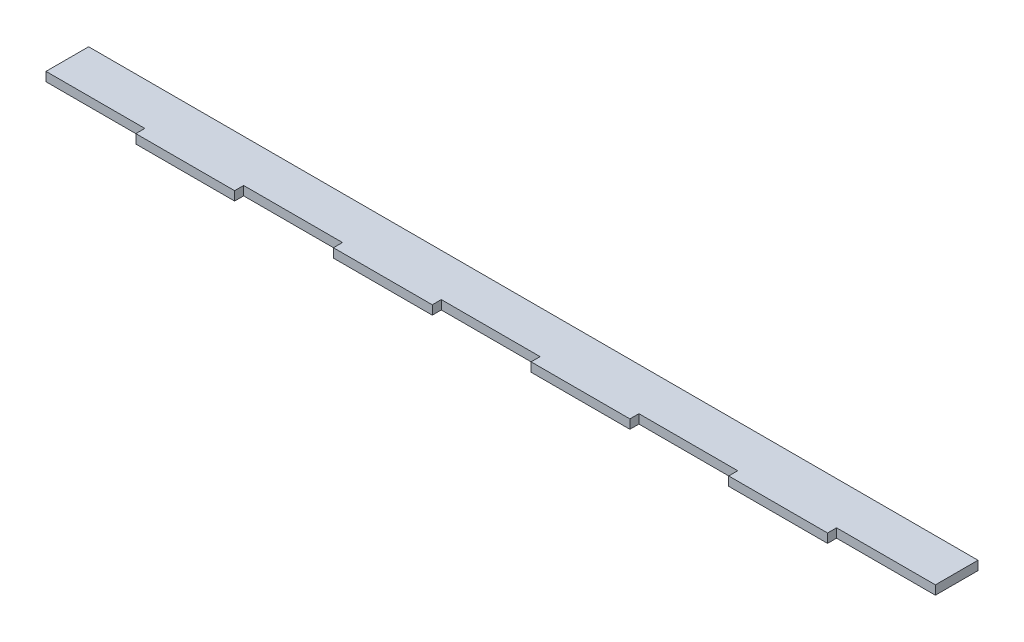
ISO-10303-21;
HEADER;
FILE_DESCRIPTION(('STEP AP214'),'2;1');
FILE_NAME('part.step','',(''),(''),'','','');
FILE_SCHEMA(('AUTOMOTIVE_DESIGN { 1 0 10303 214 1 1 1 1 }'));
ENDSEC;
DATA;
#1=APPLICATION_CONTEXT('core data for automotive mechanical design processes');
#2=APPLICATION_PROTOCOL_DEFINITION('international standard','automotive_design',2000,#1);
#3=PRODUCT_CONTEXT('',#1,'mechanical');
#4=PRODUCT('Part','Part','',(#3));
#5=PRODUCT_RELATED_PRODUCT_CATEGORY('part','',(#4));
#6=PRODUCT_DEFINITION_FORMATION('','',#4);
#7=PRODUCT_DEFINITION_CONTEXT('part definition',#1,'design');
#8=PRODUCT_DEFINITION('design','',#6,#7);
#9=PRODUCT_DEFINITION_SHAPE('','',#8);
#10=(LENGTH_UNIT() NAMED_UNIT(*) SI_UNIT(.MILLI.,.METRE.));
#11=(NAMED_UNIT(*) PLANE_ANGLE_UNIT() SI_UNIT($,.RADIAN.));
#12=(NAMED_UNIT(*) SI_UNIT($,.STERADIAN.) SOLID_ANGLE_UNIT());
#13=UNCERTAINTY_MEASURE_WITH_UNIT(LENGTH_MEASURE(1.E-05),#10,'distance_accuracy_value','');
#14=(GEOMETRIC_REPRESENTATION_CONTEXT(3) GLOBAL_UNCERTAINTY_ASSIGNED_CONTEXT((#13)) GLOBAL_UNIT_ASSIGNED_CONTEXT((#10,
#11,#12)) REPRESENTATION_CONTEXT('',''));
#15=CARTESIAN_POINT('',(0.,0.,0.));
#16=DIRECTION('',(0.,0.,1.));
#17=DIRECTION('',(1.,0.,0.));
#18=AXIS2_PLACEMENT_3D('',#15,#16,#17);
#19=CARTESIAN_POINT('',(0.,3.175,0.));
#20=DIRECTION('',(1.,0.,0.));
#21=DIRECTION('',(0.,0.,-1.));
#22=AXIS2_PLACEMENT_3D('',#19,#20,#21);
#23=PLANE('',#22);
#24=DIRECTION('',(0.,0.,1.));
#25=VECTOR('',#24,1.);
#26=CARTESIAN_POINT('',(0.,0.,0.));
#27=LINE('',#26,#25);
#28=CARTESIAN_POINT('',(0.,0.,-15.));
#29=VERTEX_POINT('',#28);
#30=CARTESIAN_POINT('',(0.,0.,0.));
#31=VERTEX_POINT('',#30);
#32=EDGE_CURVE('E201',#29,#31,#27,.T.);
#33=ORIENTED_EDGE('',*,*,#32,.T.);
#34=DIRECTION('',(0.,-1.,0.));
#35=VECTOR('',#34,1.);
#36=CARTESIAN_POINT('',(0.,3.175,0.));
#37=LINE('',#36,#35);
#38=CARTESIAN_POINT('',(0.,3.175,0.));
#39=VERTEX_POINT('',#38);
#40=EDGE_CURVE('E11',#39,#31,#37,.T.);
#41=ORIENTED_EDGE('',*,*,#40,.F.);
#42=DIRECTION('',(0.,0.,1.));
#43=VECTOR('',#42,1.);
#44=CARTESIAN_POINT('',(0.,3.175,0.));
#45=LINE('',#44,#43);
#46=CARTESIAN_POINT('',(0.,3.175,-15.));
#47=VERTEX_POINT('',#46);
#48=EDGE_CURVE('E239',#47,#39,#45,.T.);
#49=ORIENTED_EDGE('',*,*,#48,.F.);
#50=DIRECTION('',(0.,-1.,0.));
#51=VECTOR('',#50,1.);
#52=CARTESIAN_POINT('',(0.,3.175,-15.));
#53=LINE('',#52,#51);
#54=EDGE_CURVE('E197',#47,#29,#53,.T.);
#55=ORIENTED_EDGE('',*,*,#54,.T.);
#56=EDGE_LOOP('',(#33,#41,#49,#55));
#57=FACE_BOUND('',#56,.T.);
#58=ADVANCED_FACE('F33',(#57),#23,.F.);
#59=CARTESIAN_POINT('',(0.,3.175,0.));
#60=DIRECTION('',(0.,0.,-1.));
#61=DIRECTION('',(-1.,0.,0.));
#62=AXIS2_PLACEMENT_3D('',#59,#60,#61);
#63=PLANE('',#62);
#64=DIRECTION('',(1.,0.,0.));
#65=VECTOR('',#64,1.);
#66=CARTESIAN_POINT('',(0.,0.,0.));
#67=LINE('',#66,#65);
#68=CARTESIAN_POINT('',(34.7777777777778,0.,0.));
#69=VERTEX_POINT('',#68);
#70=EDGE_CURVE('E204',#31,#69,#67,.T.);
#71=ORIENTED_EDGE('',*,*,#70,.T.);
#72=DIRECTION('',(0.,-1.,0.));
#73=VECTOR('',#72,1.);
#74=CARTESIAN_POINT('',(34.7777777777778,3.175,0.));
#75=LINE('',#74,#73);
#76=CARTESIAN_POINT('',(34.7777777777778,3.175,0.));
#77=VERTEX_POINT('',#76);
#78=EDGE_CURVE('E41',#77,#69,#75,.T.);
#79=ORIENTED_EDGE('',*,*,#78,.F.);
#80=DIRECTION('',(1.,0.,0.));
#81=VECTOR('',#80,1.);
#82=CARTESIAN_POINT('',(0.,3.175,0.));
#83=LINE('',#82,#81);
#84=EDGE_CURVE('E128',#39,#77,#83,.T.);
#85=ORIENTED_EDGE('',*,*,#84,.F.);
#86=ORIENTED_EDGE('',*,*,#40,.T.);
#87=EDGE_LOOP('',(#71,#79,#85,#86));
#88=FACE_BOUND('',#87,.T.);
#89=ADVANCED_FACE('F357',(#88),#63,.F.);
#90=CARTESIAN_POINT('',(34.7777777777778,3.175,0.));
#91=DIRECTION('',(1.,0.,1.04902962956708E-13));
#92=DIRECTION('',(1.04902962956708E-13,0.,-1.));
#93=AXIS2_PLACEMENT_3D('',#90,#91,#92);
#94=PLANE('',#93);
#95=DIRECTION('',(-1.04902962956708E-13,0.,1.));
#96=VECTOR('',#95,1.);
#97=CARTESIAN_POINT('',(34.7777777777778,0.,0.));
#98=LINE('',#97,#96);
#99=CARTESIAN_POINT('',(34.7777777777775,0.,3.175));
#100=VERTEX_POINT('',#99);
#101=EDGE_CURVE('E206',#69,#100,#98,.T.);
#102=ORIENTED_EDGE('',*,*,#101,.T.);
#103=DIRECTION('',(0.,-1.,0.));
#104=VECTOR('',#103,1.);
#105=CARTESIAN_POINT('',(34.7777777777775,3.175,3.175));
#106=LINE('',#105,#104);
#107=CARTESIAN_POINT('',(34.7777777777775,3.175,3.175));
#108=VERTEX_POINT('',#107);
#109=EDGE_CURVE('E282',#108,#100,#106,.T.);
#110=ORIENTED_EDGE('',*,*,#109,.F.);
#111=DIRECTION('',(-1.04902962956708E-13,0.,1.));
#112=VECTOR('',#111,1.);
#113=CARTESIAN_POINT('',(34.7777777777778,3.175,0.));
#114=LINE('',#113,#112);
#115=EDGE_CURVE('E290',#77,#108,#114,.T.);
#116=ORIENTED_EDGE('',*,*,#115,.F.);
#117=ORIENTED_EDGE('',*,*,#78,.T.);
#118=EDGE_LOOP('',(#102,#110,#116,#117));
#119=FACE_BOUND('',#118,.T.);
#120=ADVANCED_FACE('F288',(#119),#94,.F.);
#121=CARTESIAN_POINT('',(34.7777777777775,3.175,3.175));
#122=DIRECTION('',(0.,0.,-1.));
#123=DIRECTION('',(-1.,0.,0.));
#124=AXIS2_PLACEMENT_3D('',#121,#122,#123);
#125=PLANE('',#124);
#126=DIRECTION('',(1.,0.,0.));
#127=VECTOR('',#126,1.);
#128=CARTESIAN_POINT('',(34.7777777777775,0.,3.175));
#129=LINE('',#128,#127);
#130=CARTESIAN_POINT('',(69.5555555555551,0.,3.175));
#131=VERTEX_POINT('',#130);
#132=EDGE_CURVE('E208',#100,#131,#129,.T.);
#133=ORIENTED_EDGE('',*,*,#132,.T.);
#134=DIRECTION('',(0.,-1.,0.));
#135=VECTOR('',#134,1.);
#136=CARTESIAN_POINT('',(69.5555555555551,3.175,3.175));
#137=LINE('',#136,#135);
#138=CARTESIAN_POINT('',(69.5555555555551,3.175,3.175));
#139=VERTEX_POINT('',#138);
#140=EDGE_CURVE('E279',#139,#131,#137,.T.);
#141=ORIENTED_EDGE('',*,*,#140,.F.);
#142=DIRECTION('',(1.,0.,0.));
#143=VECTOR('',#142,1.);
#144=CARTESIAN_POINT('',(34.7777777777775,3.175,3.175));
#145=LINE('',#144,#143);
#146=EDGE_CURVE('E308',#108,#139,#145,.T.);
#147=ORIENTED_EDGE('',*,*,#146,.F.);
#148=ORIENTED_EDGE('',*,*,#109,.T.);
#149=EDGE_LOOP('',(#133,#141,#147,#148));
#150=FACE_BOUND('',#149,.T.);
#151=ADVANCED_FACE('F299',(#150),#125,.F.);
#152=CARTESIAN_POINT('',(69.5555555555551,3.175,3.175));
#153=DIRECTION('',(-1.,0.,0.));
#154=DIRECTION('',(0.,0.,1.));
#155=AXIS2_PLACEMENT_3D('',#152,#153,#154);
#156=PLANE('',#155);
#157=DIRECTION('',(0.,0.,-1.));
#158=VECTOR('',#157,1.);
#159=CARTESIAN_POINT('',(69.5555555555551,0.,3.175));
#160=LINE('',#159,#158);
#161=CARTESIAN_POINT('',(69.5555555555553,0.,0.));
#162=VERTEX_POINT('',#161);
#163=EDGE_CURVE('E210',#131,#162,#160,.T.);
#164=ORIENTED_EDGE('',*,*,#163,.T.);
#165=DIRECTION('',(0.,-1.,0.));
#166=VECTOR('',#165,1.);
#167=CARTESIAN_POINT('',(69.5555555555553,3.175,0.));
#168=LINE('',#167,#166);
#169=CARTESIAN_POINT('',(69.5555555555553,3.175,0.));
#170=VERTEX_POINT('',#169);
#171=EDGE_CURVE('E276',#170,#162,#168,.T.);
#172=ORIENTED_EDGE('',*,*,#171,.F.);
#173=DIRECTION('',(0.,0.,-1.));
#174=VECTOR('',#173,1.);
#175=CARTESIAN_POINT('',(69.5555555555551,3.175,3.175));
#176=LINE('',#175,#174);
#177=EDGE_CURVE('E305',#139,#170,#176,.T.);
#178=ORIENTED_EDGE('',*,*,#177,.F.);
#179=ORIENTED_EDGE('',*,*,#140,.T.);
#180=EDGE_LOOP('',(#164,#172,#178,#179));
#181=FACE_BOUND('',#180,.T.);
#182=ADVANCED_FACE('F303',(#181),#156,.F.);
#183=CARTESIAN_POINT('',(69.5555555555553,3.175,0.));
#184=DIRECTION('',(0.,0.,-1.));
#185=DIRECTION('',(-1.,0.,0.));
#186=AXIS2_PLACEMENT_3D('',#183,#184,#185);
#187=PLANE('',#186);
#188=DIRECTION('',(1.,0.,0.));
#189=VECTOR('',#188,1.);
#190=CARTESIAN_POINT('',(69.5555555555553,0.,0.));
#191=LINE('',#190,#189);
#192=CARTESIAN_POINT('',(104.333333333333,0.,0.));
#193=VERTEX_POINT('',#192);
#194=EDGE_CURVE('E212',#162,#193,#191,.T.);
#195=ORIENTED_EDGE('',*,*,#194,.T.);
#196=DIRECTION('',(0.,-1.,0.));
#197=VECTOR('',#196,1.);
#198=CARTESIAN_POINT('',(104.333333333333,3.175,0.));
#199=LINE('',#198,#197);
#200=CARTESIAN_POINT('',(104.333333333333,3.175,0.));
#201=VERTEX_POINT('',#200);
#202=EDGE_CURVE('E273',#201,#193,#199,.T.);
#203=ORIENTED_EDGE('',*,*,#202,.F.);
#204=DIRECTION('',(1.,0.,0.));
#205=VECTOR('',#204,1.);
#206=CARTESIAN_POINT('',(69.5555555555553,3.175,0.));
#207=LINE('',#206,#205);
#208=EDGE_CURVE('E307',#170,#201,#207,.T.);
#209=ORIENTED_EDGE('',*,*,#208,.F.);
#210=ORIENTED_EDGE('',*,*,#171,.T.);
#211=EDGE_LOOP('',(#195,#203,#209,#210));
#212=FACE_BOUND('',#211,.T.);
#213=ADVANCED_FACE('F370',(#212),#187,.F.);
#214=CARTESIAN_POINT('',(104.333333333333,3.175,0.));
#215=DIRECTION('',(1.,0.,0.));
#216=DIRECTION('',(0.,0.,-1.));
#217=AXIS2_PLACEMENT_3D('',#214,#215,#216);
#218=PLANE('',#217);
#219=DIRECTION('',(0.,0.,1.));
#220=VECTOR('',#219,1.);
#221=CARTESIAN_POINT('',(104.333333333333,0.,0.));
#222=LINE('',#221,#220);
#223=CARTESIAN_POINT('',(104.333333333333,0.,3.175));
#224=VERTEX_POINT('',#223);
#225=EDGE_CURVE('E214',#193,#224,#222,.T.);
#226=ORIENTED_EDGE('',*,*,#225,.T.);
#227=DIRECTION('',(0.,-1.,0.));
#228=VECTOR('',#227,1.);
#229=CARTESIAN_POINT('',(104.333333333333,3.175,3.175));
#230=LINE('',#229,#228);
#231=CARTESIAN_POINT('',(104.333333333333,3.175,3.175));
#232=VERTEX_POINT('',#231);
#233=EDGE_CURVE('E270',#232,#224,#230,.T.);
#234=ORIENTED_EDGE('',*,*,#233,.F.);
#235=DIRECTION('',(0.,0.,1.));
#236=VECTOR('',#235,1.);
#237=CARTESIAN_POINT('',(104.333333333333,3.175,0.));
#238=LINE('',#237,#236);
#239=EDGE_CURVE('E310',#201,#232,#238,.T.);
#240=ORIENTED_EDGE('',*,*,#239,.F.);
#241=ORIENTED_EDGE('',*,*,#202,.T.);
#242=EDGE_LOOP('',(#226,#234,#240,#241));
#243=FACE_BOUND('',#242,.T.);
#244=ADVANCED_FACE('F373',(#243),#218,.F.);
#245=CARTESIAN_POINT('',(104.333333333333,3.175,3.175));
#246=DIRECTION('',(0.,0.,-1.));
#247=DIRECTION('',(-1.,0.,0.));
#248=AXIS2_PLACEMENT_3D('',#245,#246,#247);
#249=PLANE('',#248);
#250=DIRECTION('',(1.,0.,0.));
#251=VECTOR('',#250,1.);
#252=CARTESIAN_POINT('',(104.333333333333,0.,3.175));
#253=LINE('',#252,#251);
#254=CARTESIAN_POINT('',(139.11111111111,0.,3.175));
#255=VERTEX_POINT('',#254);
#256=EDGE_CURVE('E216',#224,#255,#253,.T.);
#257=ORIENTED_EDGE('',*,*,#256,.T.);
#258=DIRECTION('',(0.,-1.,0.));
#259=VECTOR('',#258,1.);
#260=CARTESIAN_POINT('',(139.11111111111,3.175,3.175));
#261=LINE('',#260,#259);
#262=CARTESIAN_POINT('',(139.11111111111,3.175,3.175));
#263=VERTEX_POINT('',#262);
#264=EDGE_CURVE('E267',#263,#255,#261,.T.);
#265=ORIENTED_EDGE('',*,*,#264,.F.);
#266=DIRECTION('',(1.,0.,0.));
#267=VECTOR('',#266,1.);
#268=CARTESIAN_POINT('',(104.333333333333,3.175,3.175));
#269=LINE('',#268,#267);
#270=EDGE_CURVE('E316',#232,#263,#269,.T.);
#271=ORIENTED_EDGE('',*,*,#270,.F.);
#272=ORIENTED_EDGE('',*,*,#233,.T.);
#273=EDGE_LOOP('',(#257,#265,#271,#272));
#274=FACE_BOUND('',#273,.T.);
#275=ADVANCED_FACE('F377',(#274),#249,.F.);
#276=CARTESIAN_POINT('',(139.11111111111,3.175,3.175));
#277=DIRECTION('',(-1.,0.,0.));
#278=DIRECTION('',(0.,0.,1.));
#279=AXIS2_PLACEMENT_3D('',#276,#277,#278);
#280=PLANE('',#279);
#281=DIRECTION('',(0.,0.,-1.));
#282=VECTOR('',#281,1.);
#283=CARTESIAN_POINT('',(139.11111111111,0.,3.175));
#284=LINE('',#283,#282);
#285=CARTESIAN_POINT('',(139.11111111111,0.,0.));
#286=VERTEX_POINT('',#285);
#287=EDGE_CURVE('E218',#255,#286,#284,.T.);
#288=ORIENTED_EDGE('',*,*,#287,.T.);
#289=DIRECTION('',(0.,-1.,0.));
#290=VECTOR('',#289,1.);
#291=CARTESIAN_POINT('',(139.11111111111,3.175,0.));
#292=LINE('',#291,#290);
#293=CARTESIAN_POINT('',(139.11111111111,3.175,0.));
#294=VERTEX_POINT('',#293);
#295=EDGE_CURVE('E264',#294,#286,#292,.T.);
#296=ORIENTED_EDGE('',*,*,#295,.F.);
#297=DIRECTION('',(0.,0.,-1.));
#298=VECTOR('',#297,1.);
#299=CARTESIAN_POINT('',(139.11111111111,3.175,3.175));
#300=LINE('',#299,#298);
#301=EDGE_CURVE('E318',#263,#294,#300,.T.);
#302=ORIENTED_EDGE('',*,*,#301,.F.);
#303=ORIENTED_EDGE('',*,*,#264,.T.);
#304=EDGE_LOOP('',(#288,#296,#302,#303));
#305=FACE_BOUND('',#304,.T.);
#306=ADVANCED_FACE('F381',(#305),#280,.F.);
#307=CARTESIAN_POINT('',(139.11111111111,3.175,0.));
#308=DIRECTION('',(0.,0.,-1.));
#309=DIRECTION('',(-1.,0.,0.));
#310=AXIS2_PLACEMENT_3D('',#307,#308,#309);
#311=PLANE('',#310);
#312=DIRECTION('',(1.,0.,0.));
#313=VECTOR('',#312,1.);
#314=CARTESIAN_POINT('',(139.11111111111,0.,0.));
#315=LINE('',#314,#313);
#316=CARTESIAN_POINT('',(173.888888888888,0.,0.));
#317=VERTEX_POINT('',#316);
#318=EDGE_CURVE('E220',#286,#317,#315,.T.);
#319=ORIENTED_EDGE('',*,*,#318,.T.);
#320=DIRECTION('',(0.,-1.,0.));
#321=VECTOR('',#320,1.);
#322=CARTESIAN_POINT('',(173.888888888888,3.175,0.));
#323=LINE('',#322,#321);
#324=CARTESIAN_POINT('',(173.888888888888,3.175,0.));
#325=VERTEX_POINT('',#324);
#326=EDGE_CURVE('E261',#325,#317,#323,.T.);
#327=ORIENTED_EDGE('',*,*,#326,.F.);
#328=DIRECTION('',(1.,0.,0.));
#329=VECTOR('',#328,1.);
#330=CARTESIAN_POINT('',(139.11111111111,3.175,0.));
#331=LINE('',#330,#329);
#332=EDGE_CURVE('E320',#294,#325,#331,.T.);
#333=ORIENTED_EDGE('',*,*,#332,.F.);
#334=ORIENTED_EDGE('',*,*,#295,.T.);
#335=EDGE_LOOP('',(#319,#327,#333,#334));
#336=FACE_BOUND('',#335,.T.);
#337=ADVANCED_FACE('F385',(#336),#311,.F.);
#338=CARTESIAN_POINT('',(173.888888888888,3.175,0.));
#339=DIRECTION('',(1.,0.,0.));
#340=DIRECTION('',(0.,0.,-1.));
#341=AXIS2_PLACEMENT_3D('',#338,#339,#340);
#342=PLANE('',#341);
#343=DIRECTION('',(0.,0.,1.));
#344=VECTOR('',#343,1.);
#345=CARTESIAN_POINT('',(173.888888888888,0.,0.));
#346=LINE('',#345,#344);
#347=CARTESIAN_POINT('',(173.888888888888,0.,3.175));
#348=VERTEX_POINT('',#347);
#349=EDGE_CURVE('E222',#317,#348,#346,.T.);
#350=ORIENTED_EDGE('',*,*,#349,.T.);
#351=DIRECTION('',(0.,-1.,0.));
#352=VECTOR('',#351,1.);
#353=CARTESIAN_POINT('',(173.888888888888,3.175,3.175));
#354=LINE('',#353,#352);
#355=CARTESIAN_POINT('',(173.888888888888,3.175,3.175));
#356=VERTEX_POINT('',#355);
#357=EDGE_CURVE('E258',#356,#348,#354,.T.);
#358=ORIENTED_EDGE('',*,*,#357,.F.);
#359=DIRECTION('',(0.,0.,1.));
#360=VECTOR('',#359,1.);
#361=CARTESIAN_POINT('',(173.888888888888,3.175,0.));
#362=LINE('',#361,#360);
#363=EDGE_CURVE('E322',#325,#356,#362,.T.);
#364=ORIENTED_EDGE('',*,*,#363,.F.);
#365=ORIENTED_EDGE('',*,*,#326,.T.);
#366=EDGE_LOOP('',(#350,#358,#364,#365));
#367=FACE_BOUND('',#366,.T.);
#368=ADVANCED_FACE('F389',(#367),#342,.F.);
#369=CARTESIAN_POINT('',(173.888888888888,3.175,3.175));
#370=DIRECTION('',(0.,0.,-1.));
#371=DIRECTION('',(-1.,0.,0.));
#372=AXIS2_PLACEMENT_3D('',#369,#370,#371);
#373=PLANE('',#372);
#374=DIRECTION('',(1.,0.,0.));
#375=VECTOR('',#374,1.);
#376=CARTESIAN_POINT('',(173.888888888888,0.,3.175));
#377=LINE('',#376,#375);
#378=CARTESIAN_POINT('',(208.666666666666,0.,3.175));
#379=VERTEX_POINT('',#378);
#380=EDGE_CURVE('E224',#348,#379,#377,.T.);
#381=ORIENTED_EDGE('',*,*,#380,.T.);
#382=DIRECTION('',(0.,-1.,0.));
#383=VECTOR('',#382,1.);
#384=CARTESIAN_POINT('',(208.666666666666,3.175,3.175));
#385=LINE('',#384,#383);
#386=CARTESIAN_POINT('',(208.666666666666,3.175,3.175));
#387=VERTEX_POINT('',#386);
#388=EDGE_CURVE('E255',#387,#379,#385,.T.);
#389=ORIENTED_EDGE('',*,*,#388,.F.);
#390=DIRECTION('',(1.,0.,0.));
#391=VECTOR('',#390,1.);
#392=CARTESIAN_POINT('',(173.888888888888,3.175,3.175));
#393=LINE('',#392,#391);
#394=EDGE_CURVE('E324',#356,#387,#393,.T.);
#395=ORIENTED_EDGE('',*,*,#394,.F.);
#396=ORIENTED_EDGE('',*,*,#357,.T.);
#397=EDGE_LOOP('',(#381,#389,#395,#396));
#398=FACE_BOUND('',#397,.T.);
#399=ADVANCED_FACE('F393',(#398),#373,.F.);
#400=CARTESIAN_POINT('',(208.666666666666,3.175,3.175));
#401=DIRECTION('',(-1.,0.,0.));
#402=DIRECTION('',(0.,0.,1.));
#403=AXIS2_PLACEMENT_3D('',#400,#401,#402);
#404=PLANE('',#403);
#405=DIRECTION('',(0.,0.,-1.));
#406=VECTOR('',#405,1.);
#407=CARTESIAN_POINT('',(208.666666666666,0.,3.175));
#408=LINE('',#407,#406);
#409=CARTESIAN_POINT('',(208.666666666666,0.,0.));
#410=VERTEX_POINT('',#409);
#411=EDGE_CURVE('E226',#379,#410,#408,.T.);
#412=ORIENTED_EDGE('',*,*,#411,.T.);
#413=DIRECTION('',(0.,-1.,0.));
#414=VECTOR('',#413,1.);
#415=CARTESIAN_POINT('',(208.666666666666,3.175,0.));
#416=LINE('',#415,#414);
#417=CARTESIAN_POINT('',(208.666666666666,3.175,0.));
#418=VERTEX_POINT('',#417);
#419=EDGE_CURVE('E252',#418,#410,#416,.T.);
#420=ORIENTED_EDGE('',*,*,#419,.F.);
#421=DIRECTION('',(0.,0.,-1.));
#422=VECTOR('',#421,1.);
#423=CARTESIAN_POINT('',(208.666666666666,3.175,3.175));
#424=LINE('',#423,#422);
#425=EDGE_CURVE('E326',#387,#418,#424,.T.);
#426=ORIENTED_EDGE('',*,*,#425,.F.);
#427=ORIENTED_EDGE('',*,*,#388,.T.);
#428=EDGE_LOOP('',(#412,#420,#426,#427));
#429=FACE_BOUND('',#428,.T.);
#430=ADVANCED_FACE('F397',(#429),#404,.F.);
#431=CARTESIAN_POINT('',(208.666666666666,3.175,0.));
#432=DIRECTION('',(0.,0.,-1.));
#433=DIRECTION('',(-1.,0.,0.));
#434=AXIS2_PLACEMENT_3D('',#431,#432,#433);
#435=PLANE('',#434);
#436=DIRECTION('',(1.,0.,0.));
#437=VECTOR('',#436,1.);
#438=CARTESIAN_POINT('',(208.666666666666,0.,0.));
#439=LINE('',#438,#437);
#440=CARTESIAN_POINT('',(243.444444444444,0.,0.));
#441=VERTEX_POINT('',#440);
#442=EDGE_CURVE('E228',#410,#441,#439,.T.);
#443=ORIENTED_EDGE('',*,*,#442,.T.);
#444=DIRECTION('',(0.,-1.,0.));
#445=VECTOR('',#444,1.);
#446=CARTESIAN_POINT('',(243.444444444444,3.175,0.));
#447=LINE('',#446,#445);
#448=CARTESIAN_POINT('',(243.444444444444,3.175,0.));
#449=VERTEX_POINT('',#448);
#450=EDGE_CURVE('E249',#449,#441,#447,.T.);
#451=ORIENTED_EDGE('',*,*,#450,.F.);
#452=DIRECTION('',(1.,0.,0.));
#453=VECTOR('',#452,1.);
#454=CARTESIAN_POINT('',(208.666666666666,3.175,0.));
#455=LINE('',#454,#453);
#456=EDGE_CURVE('E328',#418,#449,#455,.T.);
#457=ORIENTED_EDGE('',*,*,#456,.F.);
#458=ORIENTED_EDGE('',*,*,#419,.T.);
#459=EDGE_LOOP('',(#443,#451,#457,#458));
#460=FACE_BOUND('',#459,.T.);
#461=ADVANCED_FACE('F401',(#460),#435,.F.);
#462=CARTESIAN_POINT('',(243.444444444444,3.175,0.));
#463=DIRECTION('',(1.,0.,0.));
#464=DIRECTION('',(0.,0.,-1.));
#465=AXIS2_PLACEMENT_3D('',#462,#463,#464);
#466=PLANE('',#465);
#467=DIRECTION('',(0.,0.,1.));
#468=VECTOR('',#467,1.);
#469=CARTESIAN_POINT('',(243.444444444444,0.,0.));
#470=LINE('',#469,#468);
#471=CARTESIAN_POINT('',(243.444444444444,0.,3.175));
#472=VERTEX_POINT('',#471);
#473=EDGE_CURVE('E230',#441,#472,#470,.T.);
#474=ORIENTED_EDGE('',*,*,#473,.T.);
#475=DIRECTION('',(0.,-1.,0.));
#476=VECTOR('',#475,1.);
#477=CARTESIAN_POINT('',(243.444444444444,3.175,3.175));
#478=LINE('',#477,#476);
#479=CARTESIAN_POINT('',(243.444444444444,3.175,3.175));
#480=VERTEX_POINT('',#479);
#481=EDGE_CURVE('E246',#480,#472,#478,.T.);
#482=ORIENTED_EDGE('',*,*,#481,.F.);
#483=DIRECTION('',(0.,0.,1.));
#484=VECTOR('',#483,1.);
#485=CARTESIAN_POINT('',(243.444444444444,3.175,0.));
#486=LINE('',#485,#484);
#487=EDGE_CURVE('E330',#449,#480,#486,.T.);
#488=ORIENTED_EDGE('',*,*,#487,.F.);
#489=ORIENTED_EDGE('',*,*,#450,.T.);
#490=EDGE_LOOP('',(#474,#482,#488,#489));
#491=FACE_BOUND('',#490,.T.);
#492=ADVANCED_FACE('F405',(#491),#466,.F.);
#493=CARTESIAN_POINT('',(243.444444444444,3.175,3.175));
#494=DIRECTION('',(0.,0.,-1.));
#495=DIRECTION('',(-1.,0.,0.));
#496=AXIS2_PLACEMENT_3D('',#493,#494,#495);
#497=PLANE('',#496);
#498=DIRECTION('',(1.,0.,0.));
#499=VECTOR('',#498,1.);
#500=CARTESIAN_POINT('',(243.444444444444,0.,3.175));
#501=LINE('',#500,#499);
#502=CARTESIAN_POINT('',(278.222222222222,0.,3.175));
#503=VERTEX_POINT('',#502);
#504=EDGE_CURVE('E232',#472,#503,#501,.T.);
#505=ORIENTED_EDGE('',*,*,#504,.T.);
#506=DIRECTION('',(0.,-1.,0.));
#507=VECTOR('',#506,1.);
#508=CARTESIAN_POINT('',(278.222222222222,3.175,3.175));
#509=LINE('',#508,#507);
#510=CARTESIAN_POINT('',(278.222222222222,3.175,3.175));
#511=VERTEX_POINT('',#510);
#512=EDGE_CURVE('E243',#511,#503,#509,.T.);
#513=ORIENTED_EDGE('',*,*,#512,.F.);
#514=DIRECTION('',(1.,0.,0.));
#515=VECTOR('',#514,1.);
#516=CARTESIAN_POINT('',(243.444444444444,3.175,3.175));
#517=LINE('',#516,#515);
#518=EDGE_CURVE('E332',#480,#511,#517,.T.);
#519=ORIENTED_EDGE('',*,*,#518,.F.);
#520=ORIENTED_EDGE('',*,*,#481,.T.);
#521=EDGE_LOOP('',(#505,#513,#519,#520));
#522=FACE_BOUND('',#521,.T.);
#523=ADVANCED_FACE('F338',(#522),#497,.F.);
#524=CARTESIAN_POINT('',(278.222222222222,3.175,3.175));
#525=DIRECTION('',(-1.,0.,0.));
#526=DIRECTION('',(0.,0.,1.));
#527=AXIS2_PLACEMENT_3D('',#524,#525,#526);
#528=PLANE('',#527);
#529=DIRECTION('',(0.,0.,-1.));
#530=VECTOR('',#529,1.);
#531=CARTESIAN_POINT('',(278.222222222222,0.,3.175));
#532=LINE('',#531,#530);
#533=CARTESIAN_POINT('',(278.222222222222,0.,0.));
#534=VERTEX_POINT('',#533);
#535=EDGE_CURVE('E234',#503,#534,#532,.T.);
#536=ORIENTED_EDGE('',*,*,#535,.T.);
#537=DIRECTION('',(0.,-1.,0.));
#538=VECTOR('',#537,1.);
#539=CARTESIAN_POINT('',(278.222222222222,3.175,0.));
#540=LINE('',#539,#538);
#541=CARTESIAN_POINT('',(278.222222222222,3.175,0.));
#542=VERTEX_POINT('',#541);
#543=EDGE_CURVE('E192',#542,#534,#540,.T.);
#544=ORIENTED_EDGE('',*,*,#543,.F.);
#545=DIRECTION('',(0.,0.,-1.));
#546=VECTOR('',#545,1.);
#547=CARTESIAN_POINT('',(278.222222222222,3.175,3.175));
#548=LINE('',#547,#546);
#549=EDGE_CURVE('E183',#511,#542,#548,.T.);
#550=ORIENTED_EDGE('',*,*,#549,.F.);
#551=ORIENTED_EDGE('',*,*,#512,.T.);
#552=EDGE_LOOP('',(#536,#544,#550,#551));
#553=FACE_BOUND('',#552,.T.);
#554=ADVANCED_FACE('F342',(#553),#528,.F.);
#555=CARTESIAN_POINT('',(278.222222222222,3.175,0.));
#556=DIRECTION('',(0.,0.,-1.));
#557=DIRECTION('',(-1.,0.,0.));
#558=AXIS2_PLACEMENT_3D('',#555,#556,#557);
#559=PLANE('',#558);
#560=DIRECTION('',(1.,0.,0.));
#561=VECTOR('',#560,1.);
#562=CARTESIAN_POINT('',(278.222222222222,0.,0.));
#563=LINE('',#562,#561);
#564=CARTESIAN_POINT('',(313.,0.,0.));
#565=VERTEX_POINT('',#564);
#566=EDGE_CURVE('E191',#534,#565,#563,.T.);
#567=ORIENTED_EDGE('',*,*,#566,.T.);
#568=DIRECTION('',(0.,-1.,0.));
#569=VECTOR('',#568,1.);
#570=CARTESIAN_POINT('',(313.,3.175,0.));
#571=LINE('',#570,#569);
#572=CARTESIAN_POINT('',(313.,3.175,0.));
#573=VERTEX_POINT('',#572);
#574=EDGE_CURVE('E188',#573,#565,#571,.T.);
#575=ORIENTED_EDGE('',*,*,#574,.F.);
#576=DIRECTION('',(1.,0.,0.));
#577=VECTOR('',#576,1.);
#578=CARTESIAN_POINT('',(278.222222222222,3.175,0.));
#579=LINE('',#578,#577);
#580=EDGE_CURVE('E177',#542,#573,#579,.T.);
#581=ORIENTED_EDGE('',*,*,#580,.F.);
#582=ORIENTED_EDGE('',*,*,#543,.T.);
#583=EDGE_LOOP('',(#567,#575,#581,#582));
#584=FACE_BOUND('',#583,.T.);
#585=ADVANCED_FACE('F189',(#584),#559,.F.);
#586=CARTESIAN_POINT('',(313.,3.175,0.));
#587=DIRECTION('',(-1.,0.,0.));
#588=DIRECTION('',(0.,0.,1.));
#589=AXIS2_PLACEMENT_3D('',#586,#587,#588);
#590=PLANE('',#589);
#591=DIRECTION('',(0.,0.,-1.));
#592=VECTOR('',#591,1.);
#593=CARTESIAN_POINT('',(313.,0.,0.));
#594=LINE('',#593,#592);
#595=CARTESIAN_POINT('',(313.,0.,-15.));
#596=VERTEX_POINT('',#595);
#597=EDGE_CURVE('E114',#565,#596,#594,.T.);
#598=ORIENTED_EDGE('',*,*,#597,.T.);
#599=DIRECTION('',(0.,-1.,0.));
#600=VECTOR('',#599,1.);
#601=CARTESIAN_POINT('',(313.,3.175,-15.));
#602=LINE('',#601,#600);
#603=CARTESIAN_POINT('',(313.,3.175,-15.));
#604=VERTEX_POINT('',#603);
#605=EDGE_CURVE('E193',#604,#596,#602,.T.);
#606=ORIENTED_EDGE('',*,*,#605,.F.);
#607=DIRECTION('',(0.,0.,-1.));
#608=VECTOR('',#607,1.);
#609=CARTESIAN_POINT('',(313.,3.175,0.));
#610=LINE('',#609,#608);
#611=EDGE_CURVE('E181',#573,#604,#610,.T.);
#612=ORIENTED_EDGE('',*,*,#611,.F.);
#613=ORIENTED_EDGE('',*,*,#574,.T.);
#614=EDGE_LOOP('',(#598,#606,#612,#613));
#615=FACE_BOUND('',#614,.T.);
#616=ADVANCED_FACE('F195',(#615),#590,.F.);
#617=CARTESIAN_POINT('',(0.,3.175,-15.));
#618=DIRECTION('',(0.,0.,1.));
#619=DIRECTION('',(1.,0.,0.));
#620=AXIS2_PLACEMENT_3D('',#617,#618,#619);
#621=PLANE('',#620);
#622=DIRECTION('',(-1.,0.,0.));
#623=VECTOR('',#622,1.);
#624=CARTESIAN_POINT('',(0.,0.,-15.));
#625=LINE('',#624,#623);
#626=EDGE_CURVE('E120',#596,#29,#625,.T.);
#627=ORIENTED_EDGE('',*,*,#626,.T.);
#628=ORIENTED_EDGE('',*,*,#54,.F.);
#629=DIRECTION('',(-1.,0.,0.));
#630=VECTOR('',#629,1.);
#631=CARTESIAN_POINT('',(0.,3.175,-15.));
#632=LINE('',#631,#630);
#633=EDGE_CURVE('E49',#604,#47,#632,.T.);
#634=ORIENTED_EDGE('',*,*,#633,.F.);
#635=ORIENTED_EDGE('',*,*,#605,.T.);
#636=EDGE_LOOP('',(#627,#628,#634,#635));
#637=FACE_BOUND('',#636,.T.);
#638=ADVANCED_FACE('F346',(#637),#621,.F.);
#639=CARTESIAN_POINT('',(0.,3.175,0.));
#640=DIRECTION('',(0.,-1.,0.));
#641=DIRECTION('',(0.,0.,-1.));
#642=AXIS2_PLACEMENT_3D('',#639,#640,#641);
#643=PLANE('',#642);
#644=ORIENTED_EDGE('',*,*,#48,.T.);
#645=ORIENTED_EDGE('',*,*,#84,.T.);
#646=ORIENTED_EDGE('',*,*,#115,.T.);
#647=ORIENTED_EDGE('',*,*,#146,.T.);
#648=ORIENTED_EDGE('',*,*,#177,.T.);
#649=ORIENTED_EDGE('',*,*,#208,.T.);
#650=ORIENTED_EDGE('',*,*,#239,.T.);
#651=ORIENTED_EDGE('',*,*,#270,.T.);
#652=ORIENTED_EDGE('',*,*,#301,.T.);
#653=ORIENTED_EDGE('',*,*,#332,.T.);
#654=ORIENTED_EDGE('',*,*,#363,.T.);
#655=ORIENTED_EDGE('',*,*,#394,.T.);
#656=ORIENTED_EDGE('',*,*,#425,.T.);
#657=ORIENTED_EDGE('',*,*,#456,.T.);
#658=ORIENTED_EDGE('',*,*,#487,.T.);
#659=ORIENTED_EDGE('',*,*,#518,.T.);
#660=ORIENTED_EDGE('',*,*,#549,.T.);
#661=ORIENTED_EDGE('',*,*,#580,.T.);
#662=ORIENTED_EDGE('',*,*,#611,.T.);
#663=ORIENTED_EDGE('',*,*,#633,.T.);
#664=EDGE_LOOP('',(#644,#645,#646,#647,#648,#649,#650,#651,#652,#653,#654,#655,#656,#657,#658,
#659,#660,#661,#662,#663));
#665=FACE_BOUND('',#664,.T.);
#666=ADVANCED_FACE('F179',(#665),#643,.F.);
#667=CARTESIAN_POINT('',(0.,0.,0.));
#668=DIRECTION('',(0.,-1.,0.));
#669=DIRECTION('',(0.,0.,-1.));
#670=AXIS2_PLACEMENT_3D('',#667,#668,#669);
#671=PLANE('',#670);
#672=ORIENTED_EDGE('',*,*,#32,.F.);
#673=ORIENTED_EDGE('',*,*,#626,.F.);
#674=ORIENTED_EDGE('',*,*,#597,.F.);
#675=ORIENTED_EDGE('',*,*,#566,.F.);
#676=ORIENTED_EDGE('',*,*,#535,.F.);
#677=ORIENTED_EDGE('',*,*,#504,.F.);
#678=ORIENTED_EDGE('',*,*,#473,.F.);
#679=ORIENTED_EDGE('',*,*,#442,.F.);
#680=ORIENTED_EDGE('',*,*,#411,.F.);
#681=ORIENTED_EDGE('',*,*,#380,.F.);
#682=ORIENTED_EDGE('',*,*,#349,.F.);
#683=ORIENTED_EDGE('',*,*,#318,.F.);
#684=ORIENTED_EDGE('',*,*,#287,.F.);
#685=ORIENTED_EDGE('',*,*,#256,.F.);
#686=ORIENTED_EDGE('',*,*,#225,.F.);
#687=ORIENTED_EDGE('',*,*,#194,.F.);
#688=ORIENTED_EDGE('',*,*,#163,.F.);
#689=ORIENTED_EDGE('',*,*,#132,.F.);
#690=ORIENTED_EDGE('',*,*,#101,.F.);
#691=ORIENTED_EDGE('',*,*,#70,.F.);
#692=EDGE_LOOP('',(#672,#673,#674,#675,#676,#677,#678,#679,#680,#681,#682,#683,#684,#685,#686,
#687,#688,#689,#690,#691));
#693=FACE_BOUND('',#692,.T.);
#694=ADVANCED_FACE('F294',(#693),#671,.T.);
#695=CLOSED_SHELL('',(#58,#89,#120,#151,#182,#213,#244,#275,#306,#337,#368,#399,#430,#461,#492,
#523,#554,#585,#616,#638,#666,#694));
#696=MANIFOLD_SOLID_BREP('B2',#695);
#697=ADVANCED_BREP_SHAPE_REPRESENTATION('',(#18,#696),#14);
#698=SHAPE_DEFINITION_REPRESENTATION(#9,#697);
ENDSEC;
END-ISO-10303-21;
